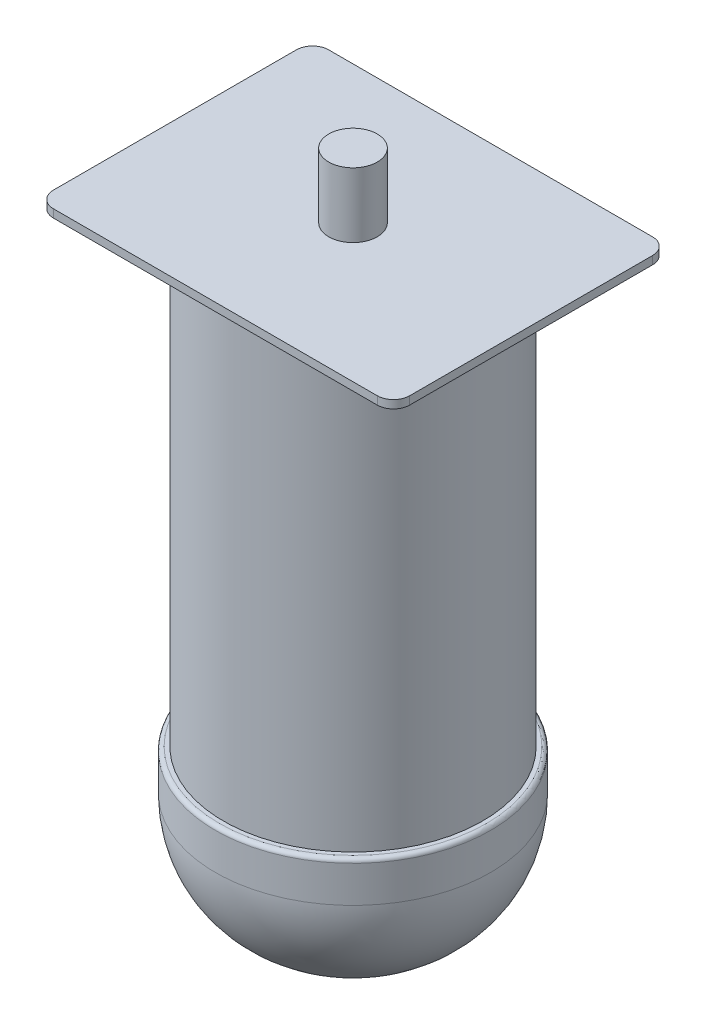
ISO-10303-21;
HEADER;
FILE_DESCRIPTION(('STEP AP214'),'2;1');
FILE_NAME('part.step','',(''),(''),'','','');
FILE_SCHEMA(('AUTOMOTIVE_DESIGN { 1 0 10303 214 1 1 1 1 }'));
ENDSEC;
DATA;
#1=APPLICATION_CONTEXT('core data for automotive mechanical design processes');
#2=APPLICATION_PROTOCOL_DEFINITION('international standard','automotive_design',2000,#1);
#3=PRODUCT_CONTEXT('',#1,'mechanical');
#4=PRODUCT('Part','Part','',(#3));
#5=PRODUCT_RELATED_PRODUCT_CATEGORY('part','',(#4));
#6=PRODUCT_DEFINITION_FORMATION('','',#4);
#7=PRODUCT_DEFINITION_CONTEXT('part definition',#1,'design');
#8=PRODUCT_DEFINITION('design','',#6,#7);
#9=PRODUCT_DEFINITION_SHAPE('','',#8);
#10=(LENGTH_UNIT() NAMED_UNIT(*) SI_UNIT(.MILLI.,.METRE.));
#11=(NAMED_UNIT(*) PLANE_ANGLE_UNIT() SI_UNIT($,.RADIAN.));
#12=(NAMED_UNIT(*) SI_UNIT($,.STERADIAN.) SOLID_ANGLE_UNIT());
#13=UNCERTAINTY_MEASURE_WITH_UNIT(LENGTH_MEASURE(1.E-05),#10,'distance_accuracy_value','');
#14=(GEOMETRIC_REPRESENTATION_CONTEXT(3) GLOBAL_UNCERTAINTY_ASSIGNED_CONTEXT((#13)) GLOBAL_UNIT_ASSIGNED_CONTEXT((#10,
#11,#12)) REPRESENTATION_CONTEXT('',''));
#15=CARTESIAN_POINT('',(0.,0.,0.));
#16=DIRECTION('',(0.,0.,1.));
#17=DIRECTION('',(1.,0.,0.));
#18=AXIS2_PLACEMENT_3D('',#15,#16,#17);
#19=CARTESIAN_POINT('',(42.,1.,-32.));
#20=DIRECTION('',(0.,-1.,0.));
#21=DIRECTION('',(0.,0.,-1.));
#22=AXIS2_PLACEMENT_3D('',#19,#20,#21);
#23=PLANE('',#22);
#24=CARTESIAN_POINT('',(42.,1.,-32.));
#25=DIRECTION('',(0.,1.,0.));
#26=DIRECTION('',(0.,0.,-1.));
#27=AXIS2_PLACEMENT_3D('',#24,#25,#26);
#28=CIRCLE('',#27,2.);
#29=CARTESIAN_POINT('',(44.,1.,-32.));
#30=VERTEX_POINT('',#29);
#31=CARTESIAN_POINT('',(42.,1.,-34.));
#32=VERTEX_POINT('',#31);
#33=EDGE_CURVE('E146',#30,#32,#28,.T.);
#34=ORIENTED_EDGE('',*,*,#33,.T.);
#35=DIRECTION('',(-1.,0.,0.));
#36=VECTOR('',#35,1.);
#37=CARTESIAN_POINT('',(2.00000000000001,1.,-34.));
#38=LINE('',#37,#36);
#39=CARTESIAN_POINT('',(2.00000000000001,1.,-34.));
#40=VERTEX_POINT('',#39);
#41=EDGE_CURVE('E94',#32,#40,#38,.T.);
#42=ORIENTED_EDGE('',*,*,#41,.T.);
#43=CARTESIAN_POINT('',(2.,1.,-32.));
#44=DIRECTION('',(0.,1.,0.));
#45=DIRECTION('',(0.,0.,-1.));
#46=AXIS2_PLACEMENT_3D('',#43,#44,#45);
#47=CIRCLE('',#46,2.);
#48=CARTESIAN_POINT('',(0.,1.,-32.));
#49=VERTEX_POINT('',#48);
#50=EDGE_CURVE('E244',#40,#49,#47,.T.);
#51=ORIENTED_EDGE('',*,*,#50,.T.);
#52=DIRECTION('',(0.,0.,1.));
#53=VECTOR('',#52,1.);
#54=CARTESIAN_POINT('',(0.,1.,-2.00000000000001));
#55=LINE('',#54,#53);
#56=CARTESIAN_POINT('',(0.,1.,-2.00000000000001));
#57=VERTEX_POINT('',#56);
#58=EDGE_CURVE('E246',#49,#57,#55,.T.);
#59=ORIENTED_EDGE('',*,*,#58,.T.);
#60=CARTESIAN_POINT('',(2.,1.,-2.));
#61=DIRECTION('',(0.,1.,0.));
#62=DIRECTION('',(0.,0.,-1.));
#63=AXIS2_PLACEMENT_3D('',#60,#61,#62);
#64=CIRCLE('',#63,2.);
#65=CARTESIAN_POINT('',(2.00000000000001,1.,0.));
#66=VERTEX_POINT('',#65);
#67=EDGE_CURVE('E113',#57,#66,#64,.T.);
#68=ORIENTED_EDGE('',*,*,#67,.T.);
#69=DIRECTION('',(1.,0.,0.));
#70=VECTOR('',#69,1.);
#71=CARTESIAN_POINT('',(2.00000000000001,1.,0.));
#72=LINE('',#71,#70);
#73=CARTESIAN_POINT('',(42.,1.,0.));
#74=VERTEX_POINT('',#73);
#75=EDGE_CURVE('E107',#66,#74,#72,.T.);
#76=ORIENTED_EDGE('',*,*,#75,.T.);
#77=CARTESIAN_POINT('',(42.,1.,-2.));
#78=DIRECTION('',(0.,1.,0.));
#79=DIRECTION('',(0.,0.,1.));
#80=AXIS2_PLACEMENT_3D('',#77,#78,#79);
#81=CIRCLE('',#80,2.);
#82=CARTESIAN_POINT('',(44.,1.,-2.00000000000001));
#83=VERTEX_POINT('',#82);
#84=EDGE_CURVE('E111',#74,#83,#81,.T.);
#85=ORIENTED_EDGE('',*,*,#84,.T.);
#86=DIRECTION('',(0.,0.,-1.));
#87=VECTOR('',#86,1.);
#88=CARTESIAN_POINT('',(44.,1.,-2.00000000000001));
#89=LINE('',#88,#87);
#90=EDGE_CURVE('E50',#83,#30,#89,.T.);
#91=ORIENTED_EDGE('',*,*,#90,.T.);
#92=EDGE_LOOP('',(#34,#42,#51,#59,#68,#76,#85,#91));
#93=FACE_BOUND('',#92,.T.);
#94=CARTESIAN_POINT('',(22.,1.,-17.));
#95=DIRECTION('',(0.,-1.,0.));
#96=DIRECTION('',(0.,0.,-1.));
#97=AXIS2_PLACEMENT_3D('',#94,#95,#96);
#98=CIRCLE('',#97,3.);
#99=CARTESIAN_POINT('',(22.,1.,-20.));
#100=VERTEX_POINT('',#99);
#101=EDGE_CURVE('E11',#100,#100,#98,.F.);
#102=ORIENTED_EDGE('',*,*,#101,.F.);
#103=EDGE_LOOP('',(#102));
#104=FACE_BOUND('',#103,.T.);
#105=ADVANCED_FACE('F33',(#93,#104),#23,.F.);
#106=CARTESIAN_POINT('',(42.,0.,-32.));
#107=DIRECTION('',(0.,-1.,0.));
#108=DIRECTION('',(0.,0.,-1.));
#109=AXIS2_PLACEMENT_3D('',#106,#107,#108);
#110=PLANE('',#109);
#111=CARTESIAN_POINT('',(42.,0.,-32.));
#112=DIRECTION('',(0.,1.,0.));
#113=DIRECTION('',(0.,0.,-1.));
#114=AXIS2_PLACEMENT_3D('',#111,#112,#113);
#115=CIRCLE('',#114,2.);
#116=CARTESIAN_POINT('',(44.,0.,-32.));
#117=VERTEX_POINT('',#116);
#118=CARTESIAN_POINT('',(42.,0.,-34.));
#119=VERTEX_POINT('',#118);
#120=EDGE_CURVE('E131',#117,#119,#115,.T.);
#121=ORIENTED_EDGE('',*,*,#120,.F.);
#122=DIRECTION('',(0.,0.,-1.));
#123=VECTOR('',#122,1.);
#124=CARTESIAN_POINT('',(44.,0.,-2.00000000000001));
#125=LINE('',#124,#123);
#126=CARTESIAN_POINT('',(44.,0.,-2.00000000000001));
#127=VERTEX_POINT('',#126);
#128=EDGE_CURVE('E85',#127,#117,#125,.T.);
#129=ORIENTED_EDGE('',*,*,#128,.F.);
#130=CARTESIAN_POINT('',(42.,0.,-2.));
#131=DIRECTION('',(0.,1.,0.));
#132=DIRECTION('',(0.,0.,1.));
#133=AXIS2_PLACEMENT_3D('',#130,#131,#132);
#134=CIRCLE('',#133,2.);
#135=CARTESIAN_POINT('',(42.,0.,0.));
#136=VERTEX_POINT('',#135);
#137=EDGE_CURVE('E79',#136,#127,#134,.T.);
#138=ORIENTED_EDGE('',*,*,#137,.F.);
#139=DIRECTION('',(1.,0.,0.));
#140=VECTOR('',#139,1.);
#141=CARTESIAN_POINT('',(2.00000000000001,0.,0.));
#142=LINE('',#141,#140);
#143=CARTESIAN_POINT('',(2.00000000000001,0.,0.));
#144=VERTEX_POINT('',#143);
#145=EDGE_CURVE('E121',#144,#136,#142,.T.);
#146=ORIENTED_EDGE('',*,*,#145,.F.);
#147=CARTESIAN_POINT('',(2.,0.,-2.));
#148=DIRECTION('',(0.,1.,0.));
#149=DIRECTION('',(0.,0.,-1.));
#150=AXIS2_PLACEMENT_3D('',#147,#148,#149);
#151=CIRCLE('',#150,2.);
#152=CARTESIAN_POINT('',(0.,0.,-2.00000000000001));
#153=VERTEX_POINT('',#152);
#154=EDGE_CURVE('E141',#153,#144,#151,.T.);
#155=ORIENTED_EDGE('',*,*,#154,.F.);
#156=DIRECTION('',(0.,0.,1.));
#157=VECTOR('',#156,1.);
#158=CARTESIAN_POINT('',(0.,0.,-2.00000000000001));
#159=LINE('',#158,#157);
#160=CARTESIAN_POINT('',(0.,0.,-32.));
#161=VERTEX_POINT('',#160);
#162=EDGE_CURVE('E139',#161,#153,#159,.T.);
#163=ORIENTED_EDGE('',*,*,#162,.F.);
#164=CARTESIAN_POINT('',(2.,0.,-32.));
#165=DIRECTION('',(0.,1.,0.));
#166=DIRECTION('',(0.,0.,-1.));
#167=AXIS2_PLACEMENT_3D('',#164,#165,#166);
#168=CIRCLE('',#167,2.);
#169=CARTESIAN_POINT('',(2.00000000000001,0.,-34.));
#170=VERTEX_POINT('',#169);
#171=EDGE_CURVE('E137',#170,#161,#168,.T.);
#172=ORIENTED_EDGE('',*,*,#171,.F.);
#173=DIRECTION('',(-1.,0.,0.));
#174=VECTOR('',#173,1.);
#175=CARTESIAN_POINT('',(2.00000000000001,0.,-34.));
#176=LINE('',#175,#174);
#177=EDGE_CURVE('E134',#119,#170,#176,.T.);
#178=ORIENTED_EDGE('',*,*,#177,.F.);
#179=EDGE_LOOP('',(#121,#129,#138,#146,#155,#163,#172,#178));
#180=FACE_BOUND('',#179,.T.);
#181=CARTESIAN_POINT('',(22.,0.,-17.));
#182=DIRECTION('',(0.,-1.,0.));
#183=DIRECTION('',(0.,0.,-1.));
#184=AXIS2_PLACEMENT_3D('',#181,#182,#183);
#185=CIRCLE('',#184,16.);
#186=CARTESIAN_POINT('',(22.,0.,-33.));
#187=VERTEX_POINT('',#186);
#188=EDGE_CURVE('E252',#187,#187,#185,.T.);
#189=ORIENTED_EDGE('',*,*,#188,.F.);
#190=EDGE_LOOP('',(#189));
#191=FACE_BOUND('',#190,.T.);
#192=ADVANCED_FACE('F199',(#180,#191),#110,.T.);
#193=CARTESIAN_POINT('',(42.,1.,-32.));
#194=DIRECTION('',(0.,-1.,0.));
#195=DIRECTION('',(0.,0.,-1.));
#196=AXIS2_PLACEMENT_3D('',#193,#194,#195);
#197=CYLINDRICAL_SURFACE('',#196,2.);
#198=ORIENTED_EDGE('',*,*,#120,.T.);
#199=DIRECTION('',(0.,-1.,0.));
#200=VECTOR('',#199,1.);
#201=CARTESIAN_POINT('',(42.,1.,-34.));
#202=LINE('',#201,#200);
#203=EDGE_CURVE('E159',#32,#119,#202,.T.);
#204=ORIENTED_EDGE('',*,*,#203,.F.);
#205=ORIENTED_EDGE('',*,*,#33,.F.);
#206=DIRECTION('',(0.,-1.,0.));
#207=VECTOR('',#206,1.);
#208=CARTESIAN_POINT('',(44.,1.,-32.));
#209=LINE('',#208,#207);
#210=EDGE_CURVE('E127',#30,#117,#209,.T.);
#211=ORIENTED_EDGE('',*,*,#210,.T.);
#212=EDGE_LOOP('',(#198,#204,#205,#211));
#213=FACE_BOUND('',#212,.T.);
#214=ADVANCED_FACE('F204',(#213),#197,.T.);
#215=CARTESIAN_POINT('',(2.00000000000001,1.,-34.));
#216=DIRECTION('',(0.,0.,1.));
#217=DIRECTION('',(1.,0.,0.));
#218=AXIS2_PLACEMENT_3D('',#215,#216,#217);
#219=PLANE('',#218);
#220=ORIENTED_EDGE('',*,*,#177,.T.);
#221=DIRECTION('',(0.,-1.,0.));
#222=VECTOR('',#221,1.);
#223=CARTESIAN_POINT('',(2.00000000000001,1.,-34.));
#224=LINE('',#223,#222);
#225=EDGE_CURVE('E156',#40,#170,#224,.T.);
#226=ORIENTED_EDGE('',*,*,#225,.F.);
#227=ORIENTED_EDGE('',*,*,#41,.F.);
#228=ORIENTED_EDGE('',*,*,#203,.T.);
#229=EDGE_LOOP('',(#220,#226,#227,#228));
#230=FACE_BOUND('',#229,.T.);
#231=ADVANCED_FACE('F228',(#230),#219,.F.);
#232=CARTESIAN_POINT('',(2.,1.,-32.));
#233=DIRECTION('',(0.,-1.,0.));
#234=DIRECTION('',(0.,0.,-1.));
#235=AXIS2_PLACEMENT_3D('',#232,#233,#234);
#236=CYLINDRICAL_SURFACE('',#235,2.);
#237=ORIENTED_EDGE('',*,*,#171,.T.);
#238=DIRECTION('',(0.,-1.,0.));
#239=VECTOR('',#238,1.);
#240=CARTESIAN_POINT('',(0.,1.,-32.));
#241=LINE('',#240,#239);
#242=EDGE_CURVE('E153',#49,#161,#241,.T.);
#243=ORIENTED_EDGE('',*,*,#242,.F.);
#244=ORIENTED_EDGE('',*,*,#50,.F.);
#245=ORIENTED_EDGE('',*,*,#225,.T.);
#246=EDGE_LOOP('',(#237,#243,#244,#245));
#247=FACE_BOUND('',#246,.T.);
#248=ADVANCED_FACE('F224',(#247),#236,.T.);
#249=CARTESIAN_POINT('',(0.,1.,-2.00000000000001));
#250=DIRECTION('',(1.,0.,0.));
#251=DIRECTION('',(0.,0.,-1.));
#252=AXIS2_PLACEMENT_3D('',#249,#250,#251);
#253=PLANE('',#252);
#254=ORIENTED_EDGE('',*,*,#162,.T.);
#255=DIRECTION('',(0.,-1.,0.));
#256=VECTOR('',#255,1.);
#257=CARTESIAN_POINT('',(0.,1.,-2.00000000000001));
#258=LINE('',#257,#256);
#259=EDGE_CURVE('E150',#57,#153,#258,.T.);
#260=ORIENTED_EDGE('',*,*,#259,.F.);
#261=ORIENTED_EDGE('',*,*,#58,.F.);
#262=ORIENTED_EDGE('',*,*,#242,.T.);
#263=EDGE_LOOP('',(#254,#260,#261,#262));
#264=FACE_BOUND('',#263,.T.);
#265=ADVANCED_FACE('F220',(#264),#253,.F.);
#266=CARTESIAN_POINT('',(2.,1.,-2.));
#267=DIRECTION('',(0.,-1.,0.));
#268=DIRECTION('',(0.,0.,-1.));
#269=AXIS2_PLACEMENT_3D('',#266,#267,#268);
#270=CYLINDRICAL_SURFACE('',#269,2.);
#271=ORIENTED_EDGE('',*,*,#154,.T.);
#272=DIRECTION('',(0.,-1.,0.));
#273=VECTOR('',#272,1.);
#274=CARTESIAN_POINT('',(2.00000000000001,1.,0.));
#275=LINE('',#274,#273);
#276=EDGE_CURVE('E122',#66,#144,#275,.T.);
#277=ORIENTED_EDGE('',*,*,#276,.F.);
#278=ORIENTED_EDGE('',*,*,#67,.F.);
#279=ORIENTED_EDGE('',*,*,#259,.T.);
#280=EDGE_LOOP('',(#271,#277,#278,#279));
#281=FACE_BOUND('',#280,.T.);
#282=ADVANCED_FACE('F217',(#281),#270,.T.);
#283=CARTESIAN_POINT('',(2.00000000000001,1.,0.));
#284=DIRECTION('',(0.,0.,-1.));
#285=DIRECTION('',(-1.,0.,0.));
#286=AXIS2_PLACEMENT_3D('',#283,#284,#285);
#287=PLANE('',#286);
#288=ORIENTED_EDGE('',*,*,#145,.T.);
#289=DIRECTION('',(0.,-1.,0.));
#290=VECTOR('',#289,1.);
#291=CARTESIAN_POINT('',(42.,1.,0.));
#292=LINE('',#291,#290);
#293=EDGE_CURVE('E118',#74,#136,#292,.T.);
#294=ORIENTED_EDGE('',*,*,#293,.F.);
#295=ORIENTED_EDGE('',*,*,#75,.F.);
#296=ORIENTED_EDGE('',*,*,#276,.T.);
#297=EDGE_LOOP('',(#288,#294,#295,#296));
#298=FACE_BOUND('',#297,.T.);
#299=ADVANCED_FACE('F119',(#298),#287,.F.);
#300=CARTESIAN_POINT('',(42.,1.,-2.));
#301=DIRECTION('',(0.,-1.,0.));
#302=DIRECTION('',(0.,0.,-1.));
#303=AXIS2_PLACEMENT_3D('',#300,#301,#302);
#304=CYLINDRICAL_SURFACE('',#303,2.);
#305=ORIENTED_EDGE('',*,*,#137,.T.);
#306=DIRECTION('',(0.,-1.,0.));
#307=VECTOR('',#306,1.);
#308=CARTESIAN_POINT('',(44.,1.,-2.00000000000001));
#309=LINE('',#308,#307);
#310=EDGE_CURVE('E123',#83,#127,#309,.T.);
#311=ORIENTED_EDGE('',*,*,#310,.F.);
#312=ORIENTED_EDGE('',*,*,#84,.F.);
#313=ORIENTED_EDGE('',*,*,#293,.T.);
#314=EDGE_LOOP('',(#305,#311,#312,#313));
#315=FACE_BOUND('',#314,.T.);
#316=ADVANCED_FACE('F125',(#315),#304,.T.);
#317=CARTESIAN_POINT('',(44.,1.,-2.00000000000001));
#318=DIRECTION('',(-1.,0.,0.));
#319=DIRECTION('',(0.,0.,1.));
#320=AXIS2_PLACEMENT_3D('',#317,#318,#319);
#321=PLANE('',#320);
#322=ORIENTED_EDGE('',*,*,#128,.T.);
#323=ORIENTED_EDGE('',*,*,#210,.F.);
#324=ORIENTED_EDGE('',*,*,#90,.F.);
#325=ORIENTED_EDGE('',*,*,#310,.T.);
#326=EDGE_LOOP('',(#322,#323,#324,#325));
#327=FACE_BOUND('',#326,.T.);
#328=ADVANCED_FACE('F210',(#327),#321,.F.);
#329=CARTESIAN_POINT('',(22.,-55.,-17.));
#330=DIRECTION('',(0.,1.,0.));
#331=DIRECTION('',(0.,0.,1.));
#332=AXIS2_PLACEMENT_3D('',#329,#330,#331);
#333=CYLINDRICAL_SURFACE('',#332,16.);
#334=CARTESIAN_POINT('',(22.,-55.,-17.));
#335=DIRECTION('',(0.,-1.,0.));
#336=DIRECTION('',(0.,0.,-1.));
#337=AXIS2_PLACEMENT_3D('',#334,#335,#336);
#338=CIRCLE('',#337,16.);
#339=CARTESIAN_POINT('',(22.,-55.,-33.));
#340=VERTEX_POINT('',#339);
#341=EDGE_CURVE('E135',#340,#340,#338,.T.);
#342=ORIENTED_EDGE('',*,*,#341,.F.);
#343=EDGE_LOOP('',(#342));
#344=FACE_BOUND('',#343,.T.);
#345=ORIENTED_EDGE('',*,*,#188,.T.);
#346=EDGE_LOOP('',(#345));
#347=FACE_BOUND('',#346,.T.);
#348=ADVANCED_FACE('F208',(#344,#347),#333,.T.);
#349=CARTESIAN_POINT('',(22.,-55.,-17.));
#350=DIRECTION('',(0.,-1.,0.));
#351=DIRECTION('',(0.,0.,-1.));
#352=AXIS2_PLACEMENT_3D('',#349,#350,#351);
#353=PLANE('',#352);
#354=CARTESIAN_POINT('',(22.,-55.,-17.));
#355=DIRECTION('',(0.,-1.,0.));
#356=DIRECTION('',(0.,0.,-1.));
#357=AXIS2_PLACEMENT_3D('',#354,#355,#356);
#358=CIRCLE('',#357,16.5);
#359=CARTESIAN_POINT('',(22.,-55.,-33.5));
#360=VERTEX_POINT('',#359);
#361=EDGE_CURVE('E42',#360,#360,#358,.F.);
#362=ORIENTED_EDGE('',*,*,#361,.T.);
#363=EDGE_LOOP('',(#362));
#364=FACE_BOUND('',#363,.T.);
#365=ORIENTED_EDGE('',*,*,#341,.T.);
#366=EDGE_LOOP('',(#365));
#367=FACE_BOUND('',#366,.T.);
#368=ADVANCED_FACE('F172',(#364,#367),#353,.F.);
#369=CARTESIAN_POINT('',(22.,-75.,-17.));
#370=DIRECTION('',(0.,1.,0.));
#371=DIRECTION('',(0.,0.,1.));
#372=AXIS2_PLACEMENT_3D('',#369,#370,#371);
#373=CYLINDRICAL_SURFACE('',#372,17.);
#374=CARTESIAN_POINT('',(22.,-55.5,-17.));
#375=DIRECTION('',(0.,-1.,0.));
#376=DIRECTION('',(0.,0.,-1.));
#377=AXIS2_PLACEMENT_3D('',#374,#375,#376);
#378=CIRCLE('',#377,17.);
#379=CARTESIAN_POINT('',(22.,-55.5,-34.));
#380=VERTEX_POINT('',#379);
#381=EDGE_CURVE('E167',#380,#380,#378,.T.);
#382=ORIENTED_EDGE('',*,*,#381,.T.);
#383=EDGE_LOOP('',(#382));
#384=FACE_BOUND('',#383,.T.);
#385=CARTESIAN_POINT('',(22.,-60.,-17.));
#386=DIRECTION('',(0.,-1.,0.));
#387=DIRECTION('',(0.,0.,-1.));
#388=AXIS2_PLACEMENT_3D('',#385,#386,#387);
#389=CIRCLE('',#388,17.);
#390=CARTESIAN_POINT('',(22.,-60.,-34.));
#391=VERTEX_POINT('',#390);
#392=EDGE_CURVE('E164',#391,#391,#389,.F.);
#393=ORIENTED_EDGE('',*,*,#392,.T.);
#394=EDGE_LOOP('',(#393));
#395=FACE_BOUND('',#394,.T.);
#396=ADVANCED_FACE('F181',(#384,#395),#373,.T.);
#397=CARTESIAN_POINT('',(22.,-75.,-17.));
#398=DIRECTION('',(0.,-1.,0.));
#399=DIRECTION('',(0.,0.,-1.));
#400=AXIS2_PLACEMENT_3D('',#397,#398,#399);
#401=PLANE('',#400);
#402=CARTESIAN_POINT('',(22.,-75.,-17.));
#403=DIRECTION('',(0.,-1.,0.));
#404=DIRECTION('',(0.,0.,-1.));
#405=AXIS2_PLACEMENT_3D('',#402,#403,#404);
#406=CIRCLE('',#405,2.);
#407=CARTESIAN_POINT('',(22.,-75.,-19.));
#408=VERTEX_POINT('',#407);
#409=EDGE_CURVE('E161',#408,#408,#406,.T.);
#410=ORIENTED_EDGE('',*,*,#409,.T.);
#411=EDGE_LOOP('',(#410));
#412=FACE_BOUND('',#411,.T.);
#413=ADVANCED_FACE('F184',(#412),#401,.T.);
#414=CARTESIAN_POINT('',(22.,-60.,-17.));
#415=DIRECTION('',(0.,-1.,0.));
#416=DIRECTION('',(0.,0.,-1.));
#417=AXIS2_PLACEMENT_3D('',#414,#415,#416);
#418=DEGENERATE_TOROIDAL_SURFACE('',#417,2.,15.,.T.);
#419=ORIENTED_EDGE('',*,*,#392,.F.);
#420=EDGE_LOOP('',(#419));
#421=FACE_BOUND('',#420,.T.);
#422=ORIENTED_EDGE('',*,*,#409,.F.);
#423=EDGE_LOOP('',(#422));
#424=FACE_BOUND('',#423,.T.);
#425=ADVANCED_FACE('F178',(#421,#424),#418,.T.);
#426=CARTESIAN_POINT('',(22.,-55.5,-17.));
#427=DIRECTION('',(0.,-1.,0.));
#428=DIRECTION('',(0.,0.,-1.));
#429=AXIS2_PLACEMENT_3D('',#426,#427,#428);
#430=TOROIDAL_SURFACE('',#429,16.5,0.5);
#431=ORIENTED_EDGE('',*,*,#361,.F.);
#432=EDGE_LOOP('',(#431));
#433=FACE_BOUND('',#432,.T.);
#434=ORIENTED_EDGE('',*,*,#381,.F.);
#435=EDGE_LOOP('',(#434));
#436=FACE_BOUND('',#435,.T.);
#437=ADVANCED_FACE('F35',(#433,#436),#430,.T.);
#438=CARTESIAN_POINT('',(22.,9.,-17.));
#439=DIRECTION('',(0.,-1.,0.));
#440=DIRECTION('',(0.,0.,-1.));
#441=AXIS2_PLACEMENT_3D('',#438,#439,#440);
#442=CYLINDRICAL_SURFACE('',#441,3.);
#443=CARTESIAN_POINT('',(22.,9.,-17.));
#444=DIRECTION('',(0.,1.,0.));
#445=DIRECTION('',(0.,0.,1.));
#446=AXIS2_PLACEMENT_3D('',#443,#444,#445);
#447=CIRCLE('',#446,3.);
#448=CARTESIAN_POINT('',(22.,9.,-14.));
#449=VERTEX_POINT('',#448);
#450=EDGE_CURVE('E255',#449,#449,#447,.T.);
#451=ORIENTED_EDGE('',*,*,#450,.F.);
#452=EDGE_LOOP('',(#451));
#453=FACE_BOUND('',#452,.T.);
#454=ORIENTED_EDGE('',*,*,#101,.T.);
#455=EDGE_LOOP('',(#454));
#456=FACE_BOUND('',#455,.T.);
#457=ADVANCED_FACE('F177',(#453,#456),#442,.T.);
#458=CARTESIAN_POINT('',(22.,9.,-17.));
#459=DIRECTION('',(0.,1.,0.));
#460=DIRECTION('',(0.,0.,1.));
#461=AXIS2_PLACEMENT_3D('',#458,#459,#460);
#462=PLANE('',#461);
#463=ORIENTED_EDGE('',*,*,#450,.T.);
#464=EDGE_LOOP('',(#463));
#465=FACE_BOUND('',#464,.T.);
#466=ADVANCED_FACE('F261',(#465),#462,.T.);
#467=CLOSED_SHELL('',(#105,#192,#214,#231,#248,#265,#282,#299,#316,#328,#348,#368,#396,#413,
#425,#437,#457,#466));
#468=MANIFOLD_SOLID_BREP('B2',#467);
#469=ADVANCED_BREP_SHAPE_REPRESENTATION('',(#18,#468),#14);
#470=SHAPE_DEFINITION_REPRESENTATION(#9,#469);
ENDSEC;
END-ISO-10303-21;
